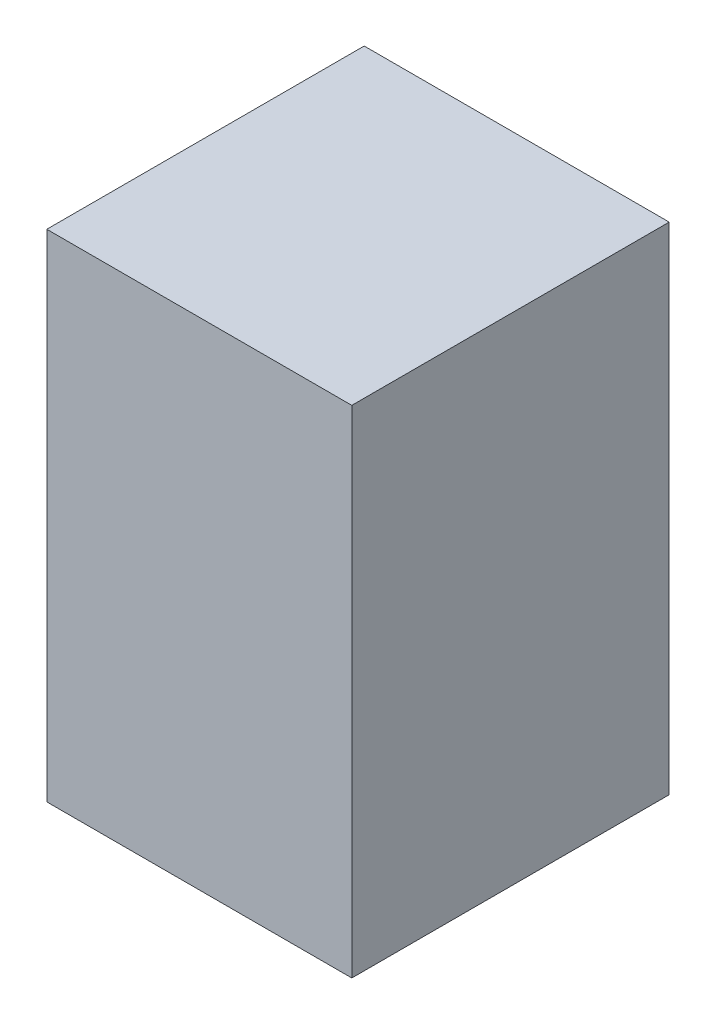
ISO-10303-21;
HEADER;
FILE_DESCRIPTION(('STEP AP214'),'2;1');
FILE_NAME('part.step','',(''),(''),'','','');
FILE_SCHEMA(('AUTOMOTIVE_DESIGN { 1 0 10303 214 1 1 1 1 }'));
ENDSEC;
DATA;
#1=APPLICATION_CONTEXT('core data for automotive mechanical design processes');
#2=APPLICATION_PROTOCOL_DEFINITION('international standard','automotive_design',2000,#1);
#3=PRODUCT_CONTEXT('',#1,'mechanical');
#4=PRODUCT('Part','Part','',(#3));
#5=PRODUCT_RELATED_PRODUCT_CATEGORY('part','',(#4));
#6=PRODUCT_DEFINITION_FORMATION('','',#4);
#7=PRODUCT_DEFINITION_CONTEXT('part definition',#1,'design');
#8=PRODUCT_DEFINITION('design','',#6,#7);
#9=PRODUCT_DEFINITION_SHAPE('','',#8);
#10=(LENGTH_UNIT() NAMED_UNIT(*) SI_UNIT(.MILLI.,.METRE.));
#11=(NAMED_UNIT(*) PLANE_ANGLE_UNIT() SI_UNIT($,.RADIAN.));
#12=(NAMED_UNIT(*) SI_UNIT($,.STERADIAN.) SOLID_ANGLE_UNIT());
#13=UNCERTAINTY_MEASURE_WITH_UNIT(LENGTH_MEASURE(1.E-05),#10,'distance_accuracy_value','');
#14=(GEOMETRIC_REPRESENTATION_CONTEXT(3) GLOBAL_UNCERTAINTY_ASSIGNED_CONTEXT((#13)) GLOBAL_UNIT_ASSIGNED_CONTEXT((#10,
#11,#12)) REPRESENTATION_CONTEXT('',''));
#15=CARTESIAN_POINT('',(0.,0.,0.));
#16=DIRECTION('',(0.,0.,1.));
#17=DIRECTION('',(1.,0.,0.));
#18=AXIS2_PLACEMENT_3D('',#15,#16,#17);
#19=CARTESIAN_POINT('',(0.,-2.28,0.));
#20=DIRECTION('',(0.,1.,0.));
#21=DIRECTION('',(0.,0.,-1.));
#22=AXIS2_PLACEMENT_3D('',#19,#20,#21);
#23=PLANE('',#22);
#24=DIRECTION('',(0.,0.,-1.));
#25=VECTOR('',#24,1.);
#26=CARTESIAN_POINT('',(-0.615,-2.28,0.64));
#27=LINE('',#26,#25);
#28=CARTESIAN_POINT('',(-0.615,-2.28,0.64));
#29=VERTEX_POINT('',#28);
#30=CARTESIAN_POINT('',(-0.615,-2.28,-0.64));
#31=VERTEX_POINT('',#30);
#32=EDGE_CURVE('E80',#29,#31,#27,.T.);
#33=ORIENTED_EDGE('',*,*,#32,.T.);
#34=DIRECTION('',(1.,0.,0.));
#35=VECTOR('',#34,1.);
#36=CARTESIAN_POINT('',(-0.615,-2.28,-0.64));
#37=LINE('',#36,#35);
#38=CARTESIAN_POINT('',(0.615,-2.28,-0.64));
#39=VERTEX_POINT('',#38);
#40=EDGE_CURVE('E66',#31,#39,#37,.T.);
#41=ORIENTED_EDGE('',*,*,#40,.T.);
#42=DIRECTION('',(0.,0.,1.));
#43=VECTOR('',#42,1.);
#44=CARTESIAN_POINT('',(0.615,-2.28,-0.64));
#45=LINE('',#44,#43);
#46=CARTESIAN_POINT('',(0.615,-2.28,0.64));
#47=VERTEX_POINT('',#46);
#48=EDGE_CURVE('E107',#39,#47,#45,.T.);
#49=ORIENTED_EDGE('',*,*,#48,.T.);
#50=DIRECTION('',(-1.,0.,0.));
#51=VECTOR('',#50,1.);
#52=CARTESIAN_POINT('',(0.615,-2.28,0.64));
#53=LINE('',#52,#51);
#54=EDGE_CURVE('E11',#47,#29,#53,.T.);
#55=ORIENTED_EDGE('',*,*,#54,.T.);
#56=EDGE_LOOP('',(#33,#41,#49,#55));
#57=FACE_BOUND('',#56,.T.);
#58=ADVANCED_FACE('F17',(#57),#23,.F.);
#59=CARTESIAN_POINT('',(0.,-0.28,0.));
#60=DIRECTION('',(0.,1.,0.));
#61=DIRECTION('',(0.,0.,-1.));
#62=AXIS2_PLACEMENT_3D('',#59,#60,#61);
#63=PLANE('',#62);
#64=DIRECTION('',(0.,0.,-1.));
#65=VECTOR('',#64,1.);
#66=CARTESIAN_POINT('',(-0.615,-0.28,0.64));
#67=LINE('',#66,#65);
#68=CARTESIAN_POINT('',(-0.615,-0.28,0.64));
#69=VERTEX_POINT('',#68);
#70=CARTESIAN_POINT('',(-0.615,-0.28,-0.64));
#71=VERTEX_POINT('',#70);
#72=EDGE_CURVE('E88',#69,#71,#67,.T.);
#73=ORIENTED_EDGE('',*,*,#72,.F.);
#74=DIRECTION('',(-1.,0.,0.));
#75=VECTOR('',#74,1.);
#76=CARTESIAN_POINT('',(0.615,-0.28,0.64));
#77=LINE('',#76,#75);
#78=CARTESIAN_POINT('',(0.615,-0.28,0.64));
#79=VERTEX_POINT('',#78);
#80=EDGE_CURVE('E26',#79,#69,#77,.T.);
#81=ORIENTED_EDGE('',*,*,#80,.F.);
#82=DIRECTION('',(0.,0.,1.));
#83=VECTOR('',#82,1.);
#84=CARTESIAN_POINT('',(0.615,-0.28,-0.64));
#85=LINE('',#84,#83);
#86=CARTESIAN_POINT('',(0.615,-0.28,-0.64));
#87=VERTEX_POINT('',#86);
#88=EDGE_CURVE('E77',#87,#79,#85,.T.);
#89=ORIENTED_EDGE('',*,*,#88,.F.);
#90=DIRECTION('',(1.,0.,0.));
#91=VECTOR('',#90,1.);
#92=CARTESIAN_POINT('',(-0.615,-0.28,-0.64));
#93=LINE('',#92,#91);
#94=EDGE_CURVE('E84',#71,#87,#93,.T.);
#95=ORIENTED_EDGE('',*,*,#94,.F.);
#96=EDGE_LOOP('',(#73,#81,#89,#95));
#97=FACE_BOUND('',#96,.T.);
#98=ADVANCED_FACE('F118',(#97),#63,.T.);
#99=CARTESIAN_POINT('',(0.615,-0.28,0.64));
#100=DIRECTION('',(0.,0.,-1.));
#101=DIRECTION('',(0.,-1.,0.));
#102=AXIS2_PLACEMENT_3D('',#99,#100,#101);
#103=PLANE('',#102);
#104=DIRECTION('',(0.,-1.,0.));
#105=VECTOR('',#104,1.);
#106=CARTESIAN_POINT('',(0.615,-0.28,0.64));
#107=LINE('',#106,#105);
#108=EDGE_CURVE('E104',#79,#47,#107,.T.);
#109=ORIENTED_EDGE('',*,*,#108,.F.);
#110=ORIENTED_EDGE('',*,*,#80,.T.);
#111=DIRECTION('',(0.,-1.,0.));
#112=VECTOR('',#111,1.);
#113=CARTESIAN_POINT('',(-0.615,-0.28,0.64));
#114=LINE('',#113,#112);
#115=EDGE_CURVE('E93',#69,#29,#114,.T.);
#116=ORIENTED_EDGE('',*,*,#115,.T.);
#117=ORIENTED_EDGE('',*,*,#54,.F.);
#118=EDGE_LOOP('',(#109,#110,#116,#117));
#119=FACE_BOUND('',#118,.T.);
#120=ADVANCED_FACE('F115',(#119),#103,.F.);
#121=CARTESIAN_POINT('',(0.615,-0.28,-0.64));
#122=DIRECTION('',(-1.,0.,0.));
#123=DIRECTION('',(0.,0.,1.));
#124=AXIS2_PLACEMENT_3D('',#121,#122,#123);
#125=PLANE('',#124);
#126=DIRECTION('',(0.,-1.,0.));
#127=VECTOR('',#126,1.);
#128=CARTESIAN_POINT('',(0.615,-0.28,-0.64));
#129=LINE('',#128,#127);
#130=EDGE_CURVE('E74',#87,#39,#129,.T.);
#131=ORIENTED_EDGE('',*,*,#130,.F.);
#132=ORIENTED_EDGE('',*,*,#88,.T.);
#133=ORIENTED_EDGE('',*,*,#108,.T.);
#134=ORIENTED_EDGE('',*,*,#48,.F.);
#135=EDGE_LOOP('',(#131,#132,#133,#134));
#136=FACE_BOUND('',#135,.T.);
#137=ADVANCED_FACE('F117',(#136),#125,.F.);
#138=CARTESIAN_POINT('',(-0.615,-0.28,-0.64));
#139=DIRECTION('',(0.,0.,1.));
#140=DIRECTION('',(0.,-1.,0.));
#141=AXIS2_PLACEMENT_3D('',#138,#139,#140);
#142=PLANE('',#141);
#143=DIRECTION('',(0.,-1.,0.));
#144=VECTOR('',#143,1.);
#145=CARTESIAN_POINT('',(-0.615,-0.28,-0.64));
#146=LINE('',#145,#144);
#147=EDGE_CURVE('E71',#71,#31,#146,.T.);
#148=ORIENTED_EDGE('',*,*,#147,.F.);
#149=ORIENTED_EDGE('',*,*,#94,.T.);
#150=ORIENTED_EDGE('',*,*,#130,.T.);
#151=ORIENTED_EDGE('',*,*,#40,.F.);
#152=EDGE_LOOP('',(#148,#149,#150,#151));
#153=FACE_BOUND('',#152,.T.);
#154=ADVANCED_FACE('F68',(#153),#142,.F.);
#155=CARTESIAN_POINT('',(-0.615,-0.28,0.64));
#156=DIRECTION('',(1.,0.,0.));
#157=DIRECTION('',(0.,1.,0.));
#158=AXIS2_PLACEMENT_3D('',#155,#156,#157);
#159=PLANE('',#158);
#160=ORIENTED_EDGE('',*,*,#115,.F.);
#161=ORIENTED_EDGE('',*,*,#72,.T.);
#162=ORIENTED_EDGE('',*,*,#147,.T.);
#163=ORIENTED_EDGE('',*,*,#32,.F.);
#164=EDGE_LOOP('',(#160,#161,#162,#163));
#165=FACE_BOUND('',#164,.T.);
#166=ADVANCED_FACE('F86',(#165),#159,.F.);
#167=CLOSED_SHELL('',(#58,#98,#120,#137,#154,#166));
#168=MANIFOLD_SOLID_BREP('B1',#167);
#169=ADVANCED_BREP_SHAPE_REPRESENTATION('',(#18,#168),#14);
#170=SHAPE_DEFINITION_REPRESENTATION(#9,#169);
ENDSEC;
END-ISO-10303-21;
